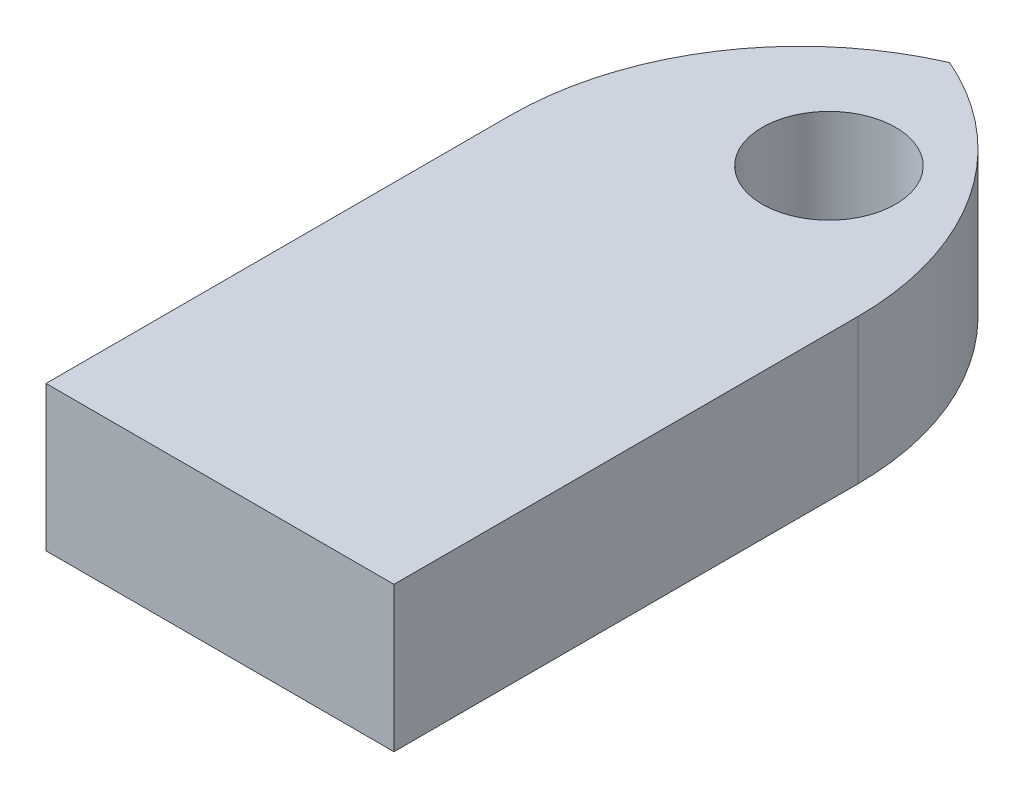
ISO-10303-21;
HEADER;
FILE_DESCRIPTION(('STEP AP214'),'2;1');
FILE_NAME('part.step','',(''),(''),'','','');
FILE_SCHEMA(('AUTOMOTIVE_DESIGN { 1 0 10303 214 1 1 1 1 }'));
ENDSEC;
DATA;
#1=APPLICATION_CONTEXT('core data for automotive mechanical design processes');
#2=APPLICATION_PROTOCOL_DEFINITION('international standard','automotive_design',2000,#1);
#3=PRODUCT_CONTEXT('',#1,'mechanical');
#4=PRODUCT('Part','Part','',(#3));
#5=PRODUCT_RELATED_PRODUCT_CATEGORY('part','',(#4));
#6=PRODUCT_DEFINITION_FORMATION('','',#4);
#7=PRODUCT_DEFINITION_CONTEXT('part definition',#1,'design');
#8=PRODUCT_DEFINITION('design','',#6,#7);
#9=PRODUCT_DEFINITION_SHAPE('','',#8);
#10=(LENGTH_UNIT() NAMED_UNIT(*) SI_UNIT(.MILLI.,.METRE.));
#11=(NAMED_UNIT(*) PLANE_ANGLE_UNIT() SI_UNIT($,.RADIAN.));
#12=(NAMED_UNIT(*) SI_UNIT($,.STERADIAN.) SOLID_ANGLE_UNIT());
#13=UNCERTAINTY_MEASURE_WITH_UNIT(LENGTH_MEASURE(1.E-05),#10,'distance_accuracy_value','');
#14=(GEOMETRIC_REPRESENTATION_CONTEXT(3) GLOBAL_UNCERTAINTY_ASSIGNED_CONTEXT((#13)) GLOBAL_UNIT_ASSIGNED_CONTEXT((#10,
#11,#12)) REPRESENTATION_CONTEXT('',''));
#15=CARTESIAN_POINT('',(0.,0.,0.));
#16=DIRECTION('',(0.,0.,1.));
#17=DIRECTION('',(1.,0.,0.));
#18=AXIS2_PLACEMENT_3D('',#15,#16,#17);
#19=CARTESIAN_POINT('',(0.,3.175,0.));
#20=DIRECTION('',(0.,-1.,0.));
#21=DIRECTION('',(0.,0.,-1.));
#22=AXIS2_PLACEMENT_3D('',#19,#20,#21);
#23=PLANE('',#22);
#24=CARTESIAN_POINT('',(1.27,3.175,-10.16));
#25=DIRECTION('',(0.,-1.,0.));
#26=DIRECTION('',(0.,0.,-1.));
#27=AXIS2_PLACEMENT_3D('',#24,#25,#26);
#28=CIRCLE('',#27,6.35);
#29=CARTESIAN_POINT('',(7.62,3.175,-10.16));
#30=VERTEX_POINT('',#29);
#31=CARTESIAN_POINT('',(3.81,3.175,-15.9798711325939));
#32=VERTEX_POINT('',#31);
#33=EDGE_CURVE('E55',#30,#32,#28,.F.);
#34=ORIENTED_EDGE('',*,*,#33,.T.);
#35=CARTESIAN_POINT('',(6.35,3.175,-10.16));
#36=DIRECTION('',(0.,-1.,0.));
#37=DIRECTION('',(0.,0.,-1.));
#38=AXIS2_PLACEMENT_3D('',#35,#36,#37);
#39=CIRCLE('',#38,6.35);
#40=CARTESIAN_POINT('',(0.,3.175,-10.16));
#41=VERTEX_POINT('',#40);
#42=EDGE_CURVE('E48',#32,#41,#39,.F.);
#43=ORIENTED_EDGE('',*,*,#42,.T.);
#44=DIRECTION('',(0.,0.,1.));
#45=VECTOR('',#44,1.);
#46=CARTESIAN_POINT('',(0.,3.175,0.));
#47=LINE('',#46,#45);
#48=CARTESIAN_POINT('',(0.,3.175,0.));
#49=VERTEX_POINT('',#48);
#50=EDGE_CURVE('E85',#41,#49,#47,.T.);
#51=ORIENTED_EDGE('',*,*,#50,.T.);
#52=DIRECTION('',(1.,0.,0.));
#53=VECTOR('',#52,1.);
#54=CARTESIAN_POINT('',(0.,3.175,0.));
#55=LINE('',#54,#53);
#56=CARTESIAN_POINT('',(7.62,3.175,0.));
#57=VERTEX_POINT('',#56);
#58=EDGE_CURVE('E88',#49,#57,#55,.T.);
#59=ORIENTED_EDGE('',*,*,#58,.T.);
#60=DIRECTION('',(0.,0.,-1.));
#61=VECTOR('',#60,1.);
#62=CARTESIAN_POINT('',(7.62,3.175,0.));
#63=LINE('',#62,#61);
#64=EDGE_CURVE('E103',#57,#30,#63,.T.);
#65=ORIENTED_EDGE('',*,*,#64,.T.);
#66=EDGE_LOOP('',(#34,#43,#51,#59,#65));
#67=FACE_BOUND('',#66,.T.);
#68=CARTESIAN_POINT('',(4.445,3.175,-12.7));
#69=DIRECTION('',(0.,1.,0.));
#70=DIRECTION('',(0.,0.,1.));
#71=AXIS2_PLACEMENT_3D('',#68,#69,#70);
#72=CIRCLE('',#71,1.4605);
#73=CARTESIAN_POINT('',(4.445,3.175,-11.2395));
#74=VERTEX_POINT('',#73);
#75=EDGE_CURVE('E131',#74,#74,#72,.T.);
#76=ORIENTED_EDGE('',*,*,#75,.F.);
#77=EDGE_LOOP('',(#76));
#78=FACE_BOUND('',#77,.T.);
#79=ADVANCED_FACE('F39',(#67,#78),#23,.F.);
#80=CARTESIAN_POINT('',(0.,0.,0.));
#81=DIRECTION('',(0.,-1.,0.));
#82=DIRECTION('',(0.,0.,-1.));
#83=AXIS2_PLACEMENT_3D('',#80,#81,#82);
#84=PLANE('',#83);
#85=DIRECTION('',(0.,0.,1.));
#86=VECTOR('',#85,1.);
#87=CARTESIAN_POINT('',(0.,0.,0.));
#88=LINE('',#87,#86);
#89=CARTESIAN_POINT('',(0.,0.,-10.16));
#90=VERTEX_POINT('',#89);
#91=CARTESIAN_POINT('',(0.,0.,0.));
#92=VERTEX_POINT('',#91);
#93=EDGE_CURVE('E107',#90,#92,#88,.T.);
#94=ORIENTED_EDGE('',*,*,#93,.F.);
#95=CARTESIAN_POINT('',(6.35,0.,-10.16));
#96=DIRECTION('',(0.,-1.,0.));
#97=DIRECTION('',(0.,0.,-1.));
#98=AXIS2_PLACEMENT_3D('',#95,#96,#97);
#99=CIRCLE('',#98,6.35);
#100=CARTESIAN_POINT('',(3.81,0.,-15.9798711325939));
#101=VERTEX_POINT('',#100);
#102=EDGE_CURVE('E117',#90,#101,#99,.T.);
#103=ORIENTED_EDGE('',*,*,#102,.T.);
#104=CARTESIAN_POINT('',(1.27,0.,-10.16));
#105=DIRECTION('',(0.,-1.,0.));
#106=DIRECTION('',(0.,0.,-1.));
#107=AXIS2_PLACEMENT_3D('',#104,#105,#106);
#108=CIRCLE('',#107,6.35);
#109=CARTESIAN_POINT('',(7.62,0.,-10.16));
#110=VERTEX_POINT('',#109);
#111=EDGE_CURVE('E111',#101,#110,#108,.T.);
#112=ORIENTED_EDGE('',*,*,#111,.T.);
#113=DIRECTION('',(0.,0.,-1.));
#114=VECTOR('',#113,1.);
#115=CARTESIAN_POINT('',(7.62,0.,0.));
#116=LINE('',#115,#114);
#117=CARTESIAN_POINT('',(7.62,0.,0.));
#118=VERTEX_POINT('',#117);
#119=EDGE_CURVE('E95',#118,#110,#116,.T.);
#120=ORIENTED_EDGE('',*,*,#119,.F.);
#121=DIRECTION('',(1.,0.,0.));
#122=VECTOR('',#121,1.);
#123=CARTESIAN_POINT('',(0.,0.,0.));
#124=LINE('',#123,#122);
#125=EDGE_CURVE('E139',#92,#118,#124,.T.);
#126=ORIENTED_EDGE('',*,*,#125,.F.);
#127=EDGE_LOOP('',(#94,#103,#112,#120,#126));
#128=FACE_BOUND('',#127,.T.);
#129=CARTESIAN_POINT('',(4.445,0.,-12.7));
#130=DIRECTION('',(0.,1.,0.));
#131=DIRECTION('',(0.,0.,1.));
#132=AXIS2_PLACEMENT_3D('',#129,#130,#131);
#133=CIRCLE('',#132,1.4605);
#134=CARTESIAN_POINT('',(4.445,0.,-11.2395));
#135=VERTEX_POINT('',#134);
#136=EDGE_CURVE('E129',#135,#135,#133,.T.);
#137=ORIENTED_EDGE('',*,*,#136,.T.);
#138=EDGE_LOOP('',(#137));
#139=FACE_BOUND('',#138,.T.);
#140=ADVANCED_FACE('F122',(#128,#139),#84,.T.);
#141=CARTESIAN_POINT('',(0.,3.175,0.));
#142=DIRECTION('',(1.,0.,0.));
#143=DIRECTION('',(0.,0.,-1.));
#144=AXIS2_PLACEMENT_3D('',#141,#142,#143);
#145=PLANE('',#144);
#146=ORIENTED_EDGE('',*,*,#50,.F.);
#147=DIRECTION('',(0.,-1.,0.));
#148=VECTOR('',#147,1.);
#149=CARTESIAN_POINT('',(0.,3.175,-10.16));
#150=LINE('',#149,#148);
#151=EDGE_CURVE('E109',#41,#90,#150,.T.);
#152=ORIENTED_EDGE('',*,*,#151,.T.);
#153=ORIENTED_EDGE('',*,*,#93,.T.);
#154=DIRECTION('',(0.,-1.,0.));
#155=VECTOR('',#154,1.);
#156=CARTESIAN_POINT('',(0.,3.175,0.));
#157=LINE('',#156,#155);
#158=EDGE_CURVE('E100',#49,#92,#157,.T.);
#159=ORIENTED_EDGE('',*,*,#158,.F.);
#160=EDGE_LOOP('',(#146,#152,#153,#159));
#161=FACE_BOUND('',#160,.T.);
#162=ADVANCED_FACE('F105',(#161),#145,.F.);
#163=CARTESIAN_POINT('',(0.,3.175,0.));
#164=DIRECTION('',(0.,0.,-1.));
#165=DIRECTION('',(-1.,0.,0.));
#166=AXIS2_PLACEMENT_3D('',#163,#164,#165);
#167=PLANE('',#166);
#168=ORIENTED_EDGE('',*,*,#125,.T.);
#169=DIRECTION('',(0.,-1.,0.));
#170=VECTOR('',#169,1.);
#171=CARTESIAN_POINT('',(7.62,3.175,0.));
#172=LINE('',#171,#170);
#173=EDGE_CURVE('E102',#57,#118,#172,.T.);
#174=ORIENTED_EDGE('',*,*,#173,.F.);
#175=ORIENTED_EDGE('',*,*,#58,.F.);
#176=ORIENTED_EDGE('',*,*,#158,.T.);
#177=EDGE_LOOP('',(#168,#174,#175,#176));
#178=FACE_BOUND('',#177,.T.);
#179=ADVANCED_FACE('F99',(#178),#167,.F.);
#180=CARTESIAN_POINT('',(7.62,3.175,0.));
#181=DIRECTION('',(-1.,0.,0.));
#182=DIRECTION('',(0.,0.,1.));
#183=AXIS2_PLACEMENT_3D('',#180,#181,#182);
#184=PLANE('',#183);
#185=ORIENTED_EDGE('',*,*,#119,.T.);
#186=DIRECTION('',(0.,-1.,0.));
#187=VECTOR('',#186,1.);
#188=CARTESIAN_POINT('',(7.62,3.175,-10.16));
#189=LINE('',#188,#187);
#190=EDGE_CURVE('E11',#110,#30,#189,.F.);
#191=ORIENTED_EDGE('',*,*,#190,.T.);
#192=ORIENTED_EDGE('',*,*,#64,.F.);
#193=ORIENTED_EDGE('',*,*,#173,.T.);
#194=EDGE_LOOP('',(#185,#191,#192,#193));
#195=FACE_BOUND('',#194,.T.);
#196=ADVANCED_FACE('F140',(#195),#184,.F.);
#197=CARTESIAN_POINT('',(4.445,3.175,-12.7));
#198=DIRECTION('',(0.,-1.,0.));
#199=DIRECTION('',(0.,0.,-1.));
#200=AXIS2_PLACEMENT_3D('',#197,#198,#199);
#201=CYLINDRICAL_SURFACE('',#200,1.4605);
#202=ORIENTED_EDGE('',*,*,#75,.T.);
#203=EDGE_LOOP('',(#202));
#204=FACE_BOUND('',#203,.T.);
#205=ORIENTED_EDGE('',*,*,#136,.F.);
#206=EDGE_LOOP('',(#205));
#207=FACE_BOUND('',#206,.T.);
#208=ADVANCED_FACE('F142',(#204,#207),#201,.F.);
#209=CARTESIAN_POINT('',(1.27,3.175,-10.16));
#210=DIRECTION('',(0.,-1.,0.));
#211=DIRECTION('',(0.,0.,-1.));
#212=AXIS2_PLACEMENT_3D('',#209,#210,#211);
#213=CYLINDRICAL_SURFACE('',#212,6.35);
#214=DIRECTION('',(0.,-1.,0.));
#215=VECTOR('',#214,1.);
#216=CARTESIAN_POINT('',(3.81,1.5875,-15.9798711325939));
#217=LINE('',#216,#215);
#218=EDGE_CURVE('E43',#32,#101,#217,.T.);
#219=ORIENTED_EDGE('',*,*,#218,.F.);
#220=ORIENTED_EDGE('',*,*,#33,.F.);
#221=ORIENTED_EDGE('',*,*,#190,.F.);
#222=ORIENTED_EDGE('',*,*,#111,.F.);
#223=EDGE_LOOP('',(#219,#220,#221,#222));
#224=FACE_BOUND('',#223,.T.);
#225=ADVANCED_FACE('F41',(#224),#213,.T.);
#226=CARTESIAN_POINT('',(6.35,3.175,-10.16));
#227=DIRECTION('',(0.,-1.,0.));
#228=DIRECTION('',(0.,0.,-1.));
#229=AXIS2_PLACEMENT_3D('',#226,#227,#228);
#230=CYLINDRICAL_SURFACE('',#229,6.35);
#231=ORIENTED_EDGE('',*,*,#42,.F.);
#232=ORIENTED_EDGE('',*,*,#218,.T.);
#233=ORIENTED_EDGE('',*,*,#102,.F.);
#234=ORIENTED_EDGE('',*,*,#151,.F.);
#235=EDGE_LOOP('',(#231,#232,#233,#234));
#236=FACE_BOUND('',#235,.T.);
#237=ADVANCED_FACE('F128',(#236),#230,.T.);
#238=CLOSED_SHELL('',(#79,#140,#162,#179,#196,#208,#225,#237));
#239=MANIFOLD_SOLID_BREP('B2',#238);
#240=ADVANCED_BREP_SHAPE_REPRESENTATION('',(#18,#239),#14);
#241=SHAPE_DEFINITION_REPRESENTATION(#9,#240);
ENDSEC;
END-ISO-10303-21;
